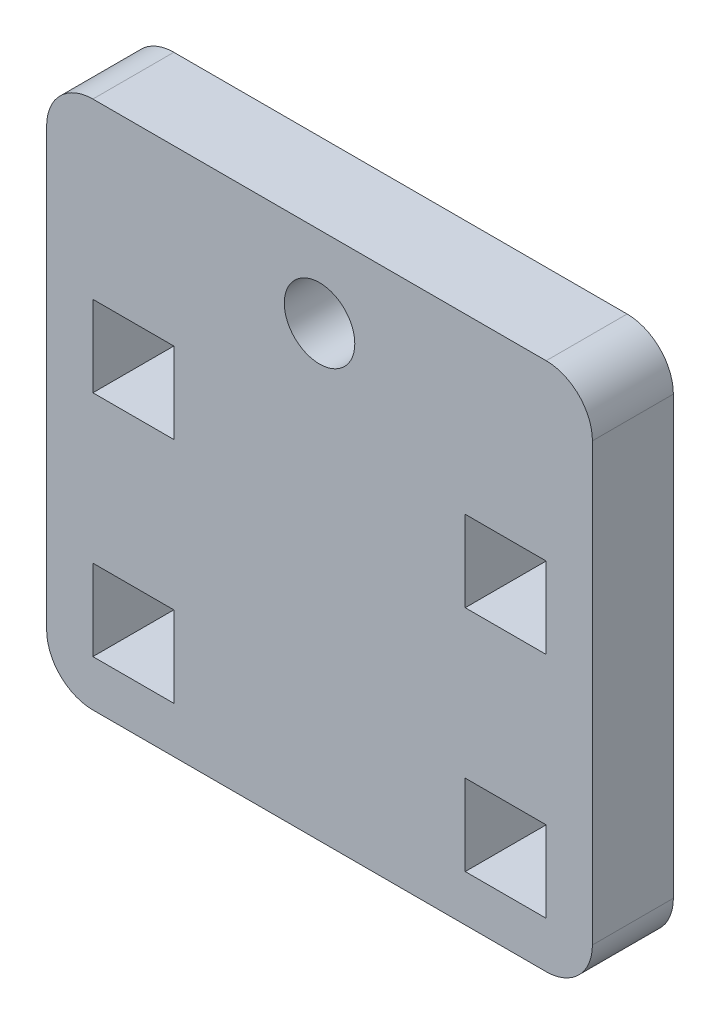
ISO-10303-21;
HEADER;
FILE_DESCRIPTION(('STEP AP214'),'2;1');
FILE_NAME('part.step','',(''),(''),'','','');
FILE_SCHEMA(('AUTOMOTIVE_DESIGN { 1 0 10303 214 1 1 1 1 }'));
ENDSEC;
DATA;
#1=APPLICATION_CONTEXT('core data for automotive mechanical design processes');
#2=APPLICATION_PROTOCOL_DEFINITION('international standard','automotive_design',2000,#1);
#3=PRODUCT_CONTEXT('',#1,'mechanical');
#4=PRODUCT('Part','Part','',(#3));
#5=PRODUCT_RELATED_PRODUCT_CATEGORY('part','',(#4));
#6=PRODUCT_DEFINITION_FORMATION('','',#4);
#7=PRODUCT_DEFINITION_CONTEXT('part definition',#1,'design');
#8=PRODUCT_DEFINITION('design','',#6,#7);
#9=PRODUCT_DEFINITION_SHAPE('','',#8);
#10=(LENGTH_UNIT() NAMED_UNIT(*) SI_UNIT(.MILLI.,.METRE.));
#11=(NAMED_UNIT(*) PLANE_ANGLE_UNIT() SI_UNIT($,.RADIAN.));
#12=(NAMED_UNIT(*) SI_UNIT($,.STERADIAN.) SOLID_ANGLE_UNIT());
#13=UNCERTAINTY_MEASURE_WITH_UNIT(LENGTH_MEASURE(1.E-05),#10,'distance_accuracy_value','');
#14=(GEOMETRIC_REPRESENTATION_CONTEXT(3) GLOBAL_UNCERTAINTY_ASSIGNED_CONTEXT((#13)) GLOBAL_UNIT_ASSIGNED_CONTEXT((#10,
#11,#12)) REPRESENTATION_CONTEXT('',''));
#15=CARTESIAN_POINT('',(0.,0.,0.));
#16=DIRECTION('',(0.,0.,1.));
#17=DIRECTION('',(1.,0.,0.));
#18=AXIS2_PLACEMENT_3D('',#15,#16,#17);
#19=CARTESIAN_POINT('',(0.,0.,3.5));
#20=DIRECTION('',(0.,0.,-1.));
#21=DIRECTION('',(-1.,0.,0.));
#22=AXIS2_PLACEMENT_3D('',#19,#20,#21);
#23=PLANE('',#22);
#24=DIRECTION('',(-1.,0.,0.));
#25=VECTOR('',#24,1.);
#26=CARTESIAN_POINT('',(6.3,15.38,3.5));
#27=LINE('',#26,#25);
#28=CARTESIAN_POINT('',(9.8,15.38,3.5));
#29=VERTEX_POINT('',#28);
#30=CARTESIAN_POINT('',(6.3,15.38,3.5));
#31=VERTEX_POINT('',#30);
#32=EDGE_CURVE('E239',#29,#31,#27,.T.);
#33=ORIENTED_EDGE('',*,*,#32,.F.);
#34=DIRECTION('',(0.,1.,0.));
#35=VECTOR('',#34,1.);
#36=CARTESIAN_POINT('',(9.8,15.38,3.5));
#37=LINE('',#36,#35);
#38=CARTESIAN_POINT('',(9.8,11.88,3.5));
#39=VERTEX_POINT('',#38);
#40=EDGE_CURVE('E247',#39,#29,#37,.T.);
#41=ORIENTED_EDGE('',*,*,#40,.F.);
#42=DIRECTION('',(1.,0.,0.));
#43=VECTOR('',#42,1.);
#44=CARTESIAN_POINT('',(6.3,11.88,3.5));
#45=LINE('',#44,#43);
#46=CARTESIAN_POINT('',(6.3,11.88,3.5));
#47=VERTEX_POINT('',#46);
#48=EDGE_CURVE('E244',#47,#39,#45,.T.);
#49=ORIENTED_EDGE('',*,*,#48,.F.);
#50=DIRECTION('',(0.,-1.,0.));
#51=VECTOR('',#50,1.);
#52=CARTESIAN_POINT('',(6.3,15.38,3.5));
#53=LINE('',#52,#51);
#54=EDGE_CURVE('E241',#31,#47,#53,.T.);
#55=ORIENTED_EDGE('',*,*,#54,.F.);
#56=EDGE_LOOP('',(#33,#41,#49,#55));
#57=FACE_BOUND('',#56,.T.);
#58=DIRECTION('',(0.,-1.,0.));
#59=VECTOR('',#58,1.);
#60=CARTESIAN_POINT('',(-9.8,2.,3.5));
#61=LINE('',#60,#59);
#62=CARTESIAN_POINT('',(-9.8,5.5,3.5));
#63=VERTEX_POINT('',#62);
#64=CARTESIAN_POINT('',(-9.8,2.,3.5));
#65=VERTEX_POINT('',#64);
#66=EDGE_CURVE('E301',#63,#65,#61,.T.);
#67=ORIENTED_EDGE('',*,*,#66,.F.);
#68=DIRECTION('',(-1.,0.,0.));
#69=VECTOR('',#68,1.);
#70=CARTESIAN_POINT('',(-9.8,5.5,3.5));
#71=LINE('',#70,#69);
#72=CARTESIAN_POINT('',(-6.3,5.5,3.5));
#73=VERTEX_POINT('',#72);
#74=EDGE_CURVE('E309',#73,#63,#71,.T.);
#75=ORIENTED_EDGE('',*,*,#74,.F.);
#76=DIRECTION('',(0.,1.,0.));
#77=VECTOR('',#76,1.);
#78=CARTESIAN_POINT('',(-6.3,2.,3.5));
#79=LINE('',#78,#77);
#80=CARTESIAN_POINT('',(-6.3,2.,3.5));
#81=VERTEX_POINT('',#80);
#82=EDGE_CURVE('E306',#81,#73,#79,.T.);
#83=ORIENTED_EDGE('',*,*,#82,.F.);
#84=DIRECTION('',(1.,0.,0.));
#85=VECTOR('',#84,1.);
#86=CARTESIAN_POINT('',(-9.8,2.,3.5));
#87=LINE('',#86,#85);
#88=EDGE_CURVE('E303',#65,#81,#87,.T.);
#89=ORIENTED_EDGE('',*,*,#88,.F.);
#90=EDGE_LOOP('',(#67,#75,#83,#89));
#91=FACE_BOUND('',#90,.T.);
#92=DIRECTION('',(-1.,0.,0.));
#93=VECTOR('',#92,1.);
#94=CARTESIAN_POINT('',(-11.8,22.88,3.5));
#95=LINE('',#94,#93);
#96=CARTESIAN_POINT('',(9.8,22.88,3.5));
#97=VERTEX_POINT('',#96);
#98=CARTESIAN_POINT('',(-9.8,22.88,3.5));
#99=VERTEX_POINT('',#98);
#100=EDGE_CURVE('E340',#97,#99,#95,.T.);
#101=ORIENTED_EDGE('',*,*,#100,.T.);
#102=CARTESIAN_POINT('',(-9.8,20.88,3.5));
#103=DIRECTION('',(0.,0.,-1.));
#104=DIRECTION('',(-1.,0.,0.));
#105=AXIS2_PLACEMENT_3D('',#102,#103,#104);
#106=CIRCLE('',#105,2.);
#107=CARTESIAN_POINT('',(-11.8,20.88,3.5));
#108=VERTEX_POINT('',#107);
#109=EDGE_CURVE('E375',#99,#108,#106,.F.);
#110=ORIENTED_EDGE('',*,*,#109,.T.);
#111=DIRECTION('',(0.,-1.,0.));
#112=VECTOR('',#111,1.);
#113=CARTESIAN_POINT('',(-11.8,0.,3.5));
#114=LINE('',#113,#112);
#115=CARTESIAN_POINT('',(-11.8,2.,3.5));
#116=VERTEX_POINT('',#115);
#117=EDGE_CURVE('E332',#108,#116,#114,.T.);
#118=ORIENTED_EDGE('',*,*,#117,.T.);
#119=CARTESIAN_POINT('',(-9.8,2.,3.5));
#120=DIRECTION('',(0.,0.,-1.));
#121=DIRECTION('',(-1.,0.,0.));
#122=AXIS2_PLACEMENT_3D('',#119,#120,#121);
#123=CIRCLE('',#122,2.);
#124=CARTESIAN_POINT('',(-9.8,0.,3.5));
#125=VERTEX_POINT('',#124);
#126=EDGE_CURVE('E373',#116,#125,#123,.F.);
#127=ORIENTED_EDGE('',*,*,#126,.T.);
#128=DIRECTION('',(1.,0.,0.));
#129=VECTOR('',#128,1.);
#130=CARTESIAN_POINT('',(-11.8,0.,3.5));
#131=LINE('',#130,#129);
#132=CARTESIAN_POINT('',(9.8,0.,3.5));
#133=VERTEX_POINT('',#132);
#134=EDGE_CURVE('E335',#125,#133,#131,.T.);
#135=ORIENTED_EDGE('',*,*,#134,.T.);
#136=CARTESIAN_POINT('',(9.8,2.,3.5));
#137=DIRECTION('',(0.,0.,-1.));
#138=DIRECTION('',(-1.,0.,0.));
#139=AXIS2_PLACEMENT_3D('',#136,#137,#138);
#140=CIRCLE('',#139,2.);
#141=CARTESIAN_POINT('',(11.8,2.,3.5));
#142=VERTEX_POINT('',#141);
#143=EDGE_CURVE('E53',#133,#142,#140,.F.);
#144=ORIENTED_EDGE('',*,*,#143,.T.);
#145=DIRECTION('',(0.,1.,0.));
#146=VECTOR('',#145,1.);
#147=CARTESIAN_POINT('',(11.8,0.,3.5));
#148=LINE('',#147,#146);
#149=CARTESIAN_POINT('',(11.8,20.88,3.5));
#150=VERTEX_POINT('',#149);
#151=EDGE_CURVE('E338',#142,#150,#148,.T.);
#152=ORIENTED_EDGE('',*,*,#151,.T.);
#153=CARTESIAN_POINT('',(9.8,20.88,3.5));
#154=DIRECTION('',(0.,0.,-1.));
#155=DIRECTION('',(-1.,0.,0.));
#156=AXIS2_PLACEMENT_3D('',#153,#154,#155);
#157=CIRCLE('',#156,2.);
#158=EDGE_CURVE('E370',#150,#97,#157,.F.);
#159=ORIENTED_EDGE('',*,*,#158,.T.);
#160=EDGE_LOOP('',(#101,#110,#118,#127,#135,#144,#152,#159));
#161=FACE_BOUND('',#160,.T.);
#162=DIRECTION('',(0.,-1.,0.));
#163=VECTOR('',#162,1.);
#164=CARTESIAN_POINT('',(6.3,2.,3.5));
#165=LINE('',#164,#163);
#166=CARTESIAN_POINT('',(6.3,5.5,3.5));
#167=VERTEX_POINT('',#166);
#168=CARTESIAN_POINT('',(6.3,2.,3.5));
#169=VERTEX_POINT('',#168);
#170=EDGE_CURVE('E270',#167,#169,#165,.T.);
#171=ORIENTED_EDGE('',*,*,#170,.F.);
#172=DIRECTION('',(-1.,0.,0.));
#173=VECTOR('',#172,1.);
#174=CARTESIAN_POINT('',(6.3,5.5,3.5));
#175=LINE('',#174,#173);
#176=CARTESIAN_POINT('',(9.8,5.5,3.5));
#177=VERTEX_POINT('',#176);
#178=EDGE_CURVE('E278',#177,#167,#175,.T.);
#179=ORIENTED_EDGE('',*,*,#178,.F.);
#180=DIRECTION('',(0.,1.,0.));
#181=VECTOR('',#180,1.);
#182=CARTESIAN_POINT('',(9.8,2.,3.5));
#183=LINE('',#182,#181);
#184=CARTESIAN_POINT('',(9.8,2.,3.5));
#185=VERTEX_POINT('',#184);
#186=EDGE_CURVE('E275',#185,#177,#183,.T.);
#187=ORIENTED_EDGE('',*,*,#186,.F.);
#188=DIRECTION('',(1.,0.,0.));
#189=VECTOR('',#188,1.);
#190=CARTESIAN_POINT('',(6.3,2.,3.5));
#191=LINE('',#190,#189);
#192=EDGE_CURVE('E272',#169,#185,#191,.T.);
#193=ORIENTED_EDGE('',*,*,#192,.F.);
#194=EDGE_LOOP('',(#171,#179,#187,#193));
#195=FACE_BOUND('',#194,.T.);
#196=DIRECTION('',(0.,-1.,0.));
#197=VECTOR('',#196,1.);
#198=CARTESIAN_POINT('',(-9.8,15.38,3.5));
#199=LINE('',#198,#197);
#200=CARTESIAN_POINT('',(-9.8,15.38,3.5));
#201=VERTEX_POINT('',#200);
#202=CARTESIAN_POINT('',(-9.8,11.88,3.5));
#203=VERTEX_POINT('',#202);
#204=EDGE_CURVE('E195',#201,#203,#199,.T.);
#205=ORIENTED_EDGE('',*,*,#204,.F.);
#206=DIRECTION('',(-1.,0.,0.));
#207=VECTOR('',#206,1.);
#208=CARTESIAN_POINT('',(-9.8,15.38,3.5));
#209=LINE('',#208,#207);
#210=CARTESIAN_POINT('',(-6.3,15.38,3.5));
#211=VERTEX_POINT('',#210);
#212=EDGE_CURVE('E221',#211,#201,#209,.T.);
#213=ORIENTED_EDGE('',*,*,#212,.F.);
#214=DIRECTION('',(0.,1.,0.));
#215=VECTOR('',#214,1.);
#216=CARTESIAN_POINT('',(-6.3,15.38,3.5));
#217=LINE('',#216,#215);
#218=CARTESIAN_POINT('',(-6.3,11.88,3.5));
#219=VERTEX_POINT('',#218);
#220=EDGE_CURVE('E219',#219,#211,#217,.T.);
#221=ORIENTED_EDGE('',*,*,#220,.F.);
#222=DIRECTION('',(1.,0.,0.));
#223=VECTOR('',#222,1.);
#224=CARTESIAN_POINT('',(-9.8,11.88,3.5));
#225=LINE('',#224,#223);
#226=EDGE_CURVE('E205',#203,#219,#225,.T.);
#227=ORIENTED_EDGE('',*,*,#226,.F.);
#228=EDGE_LOOP('',(#205,#213,#221,#227));
#229=FACE_BOUND('',#228,.T.);
#230=CARTESIAN_POINT('',(0.,19.38,3.5));
#231=DIRECTION('',(0.,0.,1.));
#232=DIRECTION('',(1.,0.,0.));
#233=AXIS2_PLACEMENT_3D('',#230,#231,#232);
#234=CIRCLE('',#233,1.525);
#235=CARTESIAN_POINT('',(1.525,19.38,3.5));
#236=VERTEX_POINT('',#235);
#237=EDGE_CURVE('E228',#236,#236,#234,.T.);
#238=ORIENTED_EDGE('',*,*,#237,.F.);
#239=EDGE_LOOP('',(#238));
#240=FACE_BOUND('',#239,.T.);
#241=ADVANCED_FACE('F32',(#57,#91,#161,#195,#229,#240),#23,.F.);
#242=CARTESIAN_POINT('',(0.,0.,0.));
#243=DIRECTION('',(0.,0.,-1.));
#244=DIRECTION('',(-1.,0.,0.));
#245=AXIS2_PLACEMENT_3D('',#242,#243,#244);
#246=PLANE('',#245);
#247=DIRECTION('',(-1.,0.,0.));
#248=VECTOR('',#247,1.);
#249=CARTESIAN_POINT('',(-9.8,15.38,0.));
#250=LINE('',#249,#248);
#251=CARTESIAN_POINT('',(-6.3,15.38,0.));
#252=VERTEX_POINT('',#251);
#253=CARTESIAN_POINT('',(-9.8,15.38,0.));
#254=VERTEX_POINT('',#253);
#255=EDGE_CURVE('E206',#252,#254,#250,.T.);
#256=ORIENTED_EDGE('',*,*,#255,.T.);
#257=DIRECTION('',(0.,-1.,0.));
#258=VECTOR('',#257,1.);
#259=CARTESIAN_POINT('',(-9.8,15.38,0.));
#260=LINE('',#259,#258);
#261=CARTESIAN_POINT('',(-9.8,11.88,0.));
#262=VERTEX_POINT('',#261);
#263=EDGE_CURVE('E226',#254,#262,#260,.T.);
#264=ORIENTED_EDGE('',*,*,#263,.T.);
#265=DIRECTION('',(1.,0.,0.));
#266=VECTOR('',#265,1.);
#267=CARTESIAN_POINT('',(-9.8,11.88,0.));
#268=LINE('',#267,#266);
#269=CARTESIAN_POINT('',(-6.3,11.88,0.));
#270=VERTEX_POINT('',#269);
#271=EDGE_CURVE('E212',#262,#270,#268,.T.);
#272=ORIENTED_EDGE('',*,*,#271,.T.);
#273=DIRECTION('',(0.,1.,0.));
#274=VECTOR('',#273,1.);
#275=CARTESIAN_POINT('',(-6.3,15.38,0.));
#276=LINE('',#275,#274);
#277=EDGE_CURVE('E230',#270,#252,#276,.T.);
#278=ORIENTED_EDGE('',*,*,#277,.T.);
#279=EDGE_LOOP('',(#256,#264,#272,#278));
#280=FACE_BOUND('',#279,.T.);
#281=DIRECTION('',(0.,1.,0.));
#282=VECTOR('',#281,1.);
#283=CARTESIAN_POINT('',(9.8,15.38,0.));
#284=LINE('',#283,#282);
#285=CARTESIAN_POINT('',(9.8,11.88,0.));
#286=VERTEX_POINT('',#285);
#287=CARTESIAN_POINT('',(9.8,15.38,0.));
#288=VERTEX_POINT('',#287);
#289=EDGE_CURVE('E242',#286,#288,#284,.T.);
#290=ORIENTED_EDGE('',*,*,#289,.T.);
#291=DIRECTION('',(-1.,0.,0.));
#292=VECTOR('',#291,1.);
#293=CARTESIAN_POINT('',(6.3,15.38,0.));
#294=LINE('',#293,#292);
#295=CARTESIAN_POINT('',(6.3,15.38,0.));
#296=VERTEX_POINT('',#295);
#297=EDGE_CURVE('E213',#288,#296,#294,.T.);
#298=ORIENTED_EDGE('',*,*,#297,.T.);
#299=DIRECTION('',(0.,-1.,0.));
#300=VECTOR('',#299,1.);
#301=CARTESIAN_POINT('',(6.3,15.38,0.));
#302=LINE('',#301,#300);
#303=CARTESIAN_POINT('',(6.3,11.88,0.));
#304=VERTEX_POINT('',#303);
#305=EDGE_CURVE('E252',#296,#304,#302,.T.);
#306=ORIENTED_EDGE('',*,*,#305,.T.);
#307=DIRECTION('',(1.,0.,0.));
#308=VECTOR('',#307,1.);
#309=CARTESIAN_POINT('',(6.3,11.88,0.));
#310=LINE('',#309,#308);
#311=EDGE_CURVE('E255',#304,#286,#310,.T.);
#312=ORIENTED_EDGE('',*,*,#311,.T.);
#313=EDGE_LOOP('',(#290,#298,#306,#312));
#314=FACE_BOUND('',#313,.T.);
#315=DIRECTION('',(-1.,0.,0.));
#316=VECTOR('',#315,1.);
#317=CARTESIAN_POINT('',(6.3,5.5,0.));
#318=LINE('',#317,#316);
#319=CARTESIAN_POINT('',(9.8,5.5,0.));
#320=VERTEX_POINT('',#319);
#321=CARTESIAN_POINT('',(6.3,5.5,0.));
#322=VERTEX_POINT('',#321);
#323=EDGE_CURVE('E273',#320,#322,#318,.T.);
#324=ORIENTED_EDGE('',*,*,#323,.T.);
#325=DIRECTION('',(0.,-1.,0.));
#326=VECTOR('',#325,1.);
#327=CARTESIAN_POINT('',(6.3,2.,0.));
#328=LINE('',#327,#326);
#329=CARTESIAN_POINT('',(6.3,2.,0.));
#330=VERTEX_POINT('',#329);
#331=EDGE_CURVE('E269',#322,#330,#328,.T.);
#332=ORIENTED_EDGE('',*,*,#331,.T.);
#333=DIRECTION('',(1.,0.,0.));
#334=VECTOR('',#333,1.);
#335=CARTESIAN_POINT('',(6.3,2.,0.));
#336=LINE('',#335,#334);
#337=CARTESIAN_POINT('',(9.8,2.,0.));
#338=VERTEX_POINT('',#337);
#339=EDGE_CURVE('E283',#330,#338,#336,.T.);
#340=ORIENTED_EDGE('',*,*,#339,.T.);
#341=DIRECTION('',(0.,1.,0.));
#342=VECTOR('',#341,1.);
#343=CARTESIAN_POINT('',(9.8,2.,0.));
#344=LINE('',#343,#342);
#345=EDGE_CURVE('E286',#338,#320,#344,.T.);
#346=ORIENTED_EDGE('',*,*,#345,.T.);
#347=EDGE_LOOP('',(#324,#332,#340,#346));
#348=FACE_BOUND('',#347,.T.);
#349=DIRECTION('',(-1.,0.,0.));
#350=VECTOR('',#349,1.);
#351=CARTESIAN_POINT('',(-9.8,5.5,0.));
#352=LINE('',#351,#350);
#353=CARTESIAN_POINT('',(-6.3,5.5,0.));
#354=VERTEX_POINT('',#353);
#355=CARTESIAN_POINT('',(-9.8,5.5,0.));
#356=VERTEX_POINT('',#355);
#357=EDGE_CURVE('E304',#354,#356,#352,.T.);
#358=ORIENTED_EDGE('',*,*,#357,.T.);
#359=DIRECTION('',(0.,-1.,0.));
#360=VECTOR('',#359,1.);
#361=CARTESIAN_POINT('',(-9.8,2.,0.));
#362=LINE('',#361,#360);
#363=CARTESIAN_POINT('',(-9.8,2.,0.));
#364=VERTEX_POINT('',#363);
#365=EDGE_CURVE('E300',#356,#364,#362,.T.);
#366=ORIENTED_EDGE('',*,*,#365,.T.);
#367=DIRECTION('',(1.,0.,0.));
#368=VECTOR('',#367,1.);
#369=CARTESIAN_POINT('',(-9.8,2.,0.));
#370=LINE('',#369,#368);
#371=CARTESIAN_POINT('',(-6.3,2.,0.));
#372=VERTEX_POINT('',#371);
#373=EDGE_CURVE('E314',#364,#372,#370,.T.);
#374=ORIENTED_EDGE('',*,*,#373,.T.);
#375=DIRECTION('',(0.,1.,0.));
#376=VECTOR('',#375,1.);
#377=CARTESIAN_POINT('',(-6.3,2.,0.));
#378=LINE('',#377,#376);
#379=EDGE_CURVE('E317',#372,#354,#378,.T.);
#380=ORIENTED_EDGE('',*,*,#379,.T.);
#381=EDGE_LOOP('',(#358,#366,#374,#380));
#382=FACE_BOUND('',#381,.T.);
#383=DIRECTION('',(0.,-1.,0.));
#384=VECTOR('',#383,1.);
#385=CARTESIAN_POINT('',(-11.8,0.,0.));
#386=LINE('',#385,#384);
#387=CARTESIAN_POINT('',(-11.8,20.88,0.));
#388=VERTEX_POINT('',#387);
#389=CARTESIAN_POINT('',(-11.8,2.,0.));
#390=VERTEX_POINT('',#389);
#391=EDGE_CURVE('E331',#388,#390,#386,.T.);
#392=ORIENTED_EDGE('',*,*,#391,.F.);
#393=CARTESIAN_POINT('',(-9.8,20.88,0.));
#394=DIRECTION('',(0.,0.,-1.));
#395=DIRECTION('',(-1.,0.,0.));
#396=AXIS2_PLACEMENT_3D('',#393,#394,#395);
#397=CIRCLE('',#396,2.);
#398=CARTESIAN_POINT('',(-9.8,22.88,0.));
#399=VERTEX_POINT('',#398);
#400=EDGE_CURVE('E363',#388,#399,#397,.T.);
#401=ORIENTED_EDGE('',*,*,#400,.T.);
#402=DIRECTION('',(-1.,0.,0.));
#403=VECTOR('',#402,1.);
#404=CARTESIAN_POINT('',(-11.8,22.88,0.));
#405=LINE('',#404,#403);
#406=CARTESIAN_POINT('',(9.8,22.88,0.));
#407=VERTEX_POINT('',#406);
#408=EDGE_CURVE('E336',#407,#399,#405,.T.);
#409=ORIENTED_EDGE('',*,*,#408,.F.);
#410=CARTESIAN_POINT('',(9.8,20.88,0.));
#411=DIRECTION('',(0.,0.,-1.));
#412=DIRECTION('',(-1.,0.,0.));
#413=AXIS2_PLACEMENT_3D('',#410,#411,#412);
#414=CIRCLE('',#413,2.);
#415=CARTESIAN_POINT('',(11.8,20.88,0.));
#416=VERTEX_POINT('',#415);
#417=EDGE_CURVE('E357',#407,#416,#414,.T.);
#418=ORIENTED_EDGE('',*,*,#417,.T.);
#419=DIRECTION('',(0.,1.,0.));
#420=VECTOR('',#419,1.);
#421=CARTESIAN_POINT('',(11.8,0.,0.));
#422=LINE('',#421,#420);
#423=CARTESIAN_POINT('',(11.8,2.,0.));
#424=VERTEX_POINT('',#423);
#425=EDGE_CURVE('E349',#424,#416,#422,.T.);
#426=ORIENTED_EDGE('',*,*,#425,.F.);
#427=CARTESIAN_POINT('',(9.8,2.,0.));
#428=DIRECTION('',(0.,0.,-1.));
#429=DIRECTION('',(-1.,0.,0.));
#430=AXIS2_PLACEMENT_3D('',#427,#428,#429);
#431=CIRCLE('',#430,2.);
#432=CARTESIAN_POINT('',(9.8,0.,0.));
#433=VERTEX_POINT('',#432);
#434=EDGE_CURVE('E359',#424,#433,#431,.T.);
#435=ORIENTED_EDGE('',*,*,#434,.T.);
#436=DIRECTION('',(1.,0.,0.));
#437=VECTOR('',#436,1.);
#438=CARTESIAN_POINT('',(-11.8,0.,0.));
#439=LINE('',#438,#437);
#440=CARTESIAN_POINT('',(-9.8,0.,0.));
#441=VERTEX_POINT('',#440);
#442=EDGE_CURVE('E346',#441,#433,#439,.T.);
#443=ORIENTED_EDGE('',*,*,#442,.F.);
#444=CARTESIAN_POINT('',(-9.8,2.,0.));
#445=DIRECTION('',(0.,0.,-1.));
#446=DIRECTION('',(-1.,0.,0.));
#447=AXIS2_PLACEMENT_3D('',#444,#445,#446);
#448=CIRCLE('',#447,2.);
#449=EDGE_CURVE('E361',#441,#390,#448,.T.);
#450=ORIENTED_EDGE('',*,*,#449,.T.);
#451=EDGE_LOOP('',(#392,#401,#409,#418,#426,#435,#443,#450));
#452=FACE_BOUND('',#451,.T.);
#453=CARTESIAN_POINT('',(0.,19.38,0.));
#454=DIRECTION('',(0.,0.,1.));
#455=DIRECTION('',(1.,0.,0.));
#456=AXIS2_PLACEMENT_3D('',#453,#454,#455);
#457=CIRCLE('',#456,1.525);
#458=CARTESIAN_POINT('',(1.525,19.38,0.));
#459=VERTEX_POINT('',#458);
#460=EDGE_CURVE('E669',#459,#459,#457,.T.);
#461=ORIENTED_EDGE('',*,*,#460,.T.);
#462=EDGE_LOOP('',(#461));
#463=FACE_BOUND('',#462,.T.);
#464=ADVANCED_FACE('F391',(#280,#314,#348,#382,#452,#463),#246,.T.);
#465=CARTESIAN_POINT('',(-11.8,0.,3.5));
#466=DIRECTION('',(1.,0.,0.));
#467=DIRECTION('',(0.,0.,-1.));
#468=AXIS2_PLACEMENT_3D('',#465,#466,#467);
#469=PLANE('',#468);
#470=ORIENTED_EDGE('',*,*,#117,.F.);
#471=DIRECTION('',(0.,0.,-1.));
#472=VECTOR('',#471,1.);
#473=CARTESIAN_POINT('',(-11.8,20.88,3.5));
#474=LINE('',#473,#472);
#475=EDGE_CURVE('E354',#108,#388,#474,.T.);
#476=ORIENTED_EDGE('',*,*,#475,.T.);
#477=ORIENTED_EDGE('',*,*,#391,.T.);
#478=DIRECTION('',(0.,0.,-1.));
#479=VECTOR('',#478,1.);
#480=CARTESIAN_POINT('',(-11.8,2.,3.5));
#481=LINE('',#480,#479);
#482=EDGE_CURVE('E343',#390,#116,#481,.F.);
#483=ORIENTED_EDGE('',*,*,#482,.T.);
#484=EDGE_LOOP('',(#470,#476,#477,#483));
#485=FACE_BOUND('',#484,.T.);
#486=ADVANCED_FACE('F413',(#485),#469,.F.);
#487=CARTESIAN_POINT('',(-11.8,0.,3.5));
#488=DIRECTION('',(0.,1.,0.));
#489=DIRECTION('',(0.,0.,1.));
#490=AXIS2_PLACEMENT_3D('',#487,#488,#489);
#491=PLANE('',#490);
#492=ORIENTED_EDGE('',*,*,#134,.F.);
#493=DIRECTION('',(0.,0.,-1.));
#494=VECTOR('',#493,1.);
#495=CARTESIAN_POINT('',(-9.8,0.,3.5));
#496=LINE('',#495,#494);
#497=EDGE_CURVE('E379',#125,#441,#496,.T.);
#498=ORIENTED_EDGE('',*,*,#497,.T.);
#499=ORIENTED_EDGE('',*,*,#442,.T.);
#500=DIRECTION('',(0.,0.,-1.));
#501=VECTOR('',#500,1.);
#502=CARTESIAN_POINT('',(9.8,0.,3.5));
#503=LINE('',#502,#501);
#504=EDGE_CURVE('E377',#433,#133,#503,.F.);
#505=ORIENTED_EDGE('',*,*,#504,.T.);
#506=EDGE_LOOP('',(#492,#498,#499,#505));
#507=FACE_BOUND('',#506,.T.);
#508=ADVANCED_FACE('F385',(#507),#491,.F.);
#509=CARTESIAN_POINT('',(11.8,0.,3.5));
#510=DIRECTION('',(-1.,0.,0.));
#511=DIRECTION('',(0.,0.,1.));
#512=AXIS2_PLACEMENT_3D('',#509,#510,#511);
#513=PLANE('',#512);
#514=ORIENTED_EDGE('',*,*,#151,.F.);
#515=DIRECTION('',(0.,0.,-1.));
#516=VECTOR('',#515,1.);
#517=CARTESIAN_POINT('',(11.8,2.,3.5));
#518=LINE('',#517,#516);
#519=EDGE_CURVE('E11',#142,#424,#518,.T.);
#520=ORIENTED_EDGE('',*,*,#519,.T.);
#521=ORIENTED_EDGE('',*,*,#425,.T.);
#522=DIRECTION('',(0.,0.,-1.));
#523=VECTOR('',#522,1.);
#524=CARTESIAN_POINT('',(11.8,20.88,3.5));
#525=LINE('',#524,#523);
#526=EDGE_CURVE('E40',#416,#150,#525,.F.);
#527=ORIENTED_EDGE('',*,*,#526,.T.);
#528=EDGE_LOOP('',(#514,#520,#521,#527));
#529=FACE_BOUND('',#528,.T.);
#530=ADVANCED_FACE('F397',(#529),#513,.F.);
#531=CARTESIAN_POINT('',(-11.8,22.88,3.5));
#532=DIRECTION('',(0.,-1.,0.));
#533=DIRECTION('',(0.,0.,-1.));
#534=AXIS2_PLACEMENT_3D('',#531,#532,#533);
#535=PLANE('',#534);
#536=ORIENTED_EDGE('',*,*,#408,.T.);
#537=DIRECTION('',(0.,0.,-1.));
#538=VECTOR('',#537,1.);
#539=CARTESIAN_POINT('',(-9.8,22.88,3.5));
#540=LINE('',#539,#538);
#541=EDGE_CURVE('E368',#399,#99,#540,.F.);
#542=ORIENTED_EDGE('',*,*,#541,.T.);
#543=ORIENTED_EDGE('',*,*,#100,.F.);
#544=DIRECTION('',(0.,0.,-1.));
#545=VECTOR('',#544,1.);
#546=CARTESIAN_POINT('',(9.8,22.88,3.5));
#547=LINE('',#546,#545);
#548=EDGE_CURVE('E365',#97,#407,#547,.T.);
#549=ORIENTED_EDGE('',*,*,#548,.T.);
#550=EDGE_LOOP('',(#536,#542,#543,#549));
#551=FACE_BOUND('',#550,.T.);
#552=ADVANCED_FACE('F405',(#551),#535,.F.);
#553=CARTESIAN_POINT('',(-9.8,2.,3.5));
#554=DIRECTION('',(1.,0.,0.));
#555=DIRECTION('',(0.,0.,-1.));
#556=AXIS2_PLACEMENT_3D('',#553,#554,#555);
#557=PLANE('',#556);
#558=ORIENTED_EDGE('',*,*,#365,.F.);
#559=DIRECTION('',(0.,0.,-1.));
#560=VECTOR('',#559,1.);
#561=CARTESIAN_POINT('',(-9.8,5.5,3.5));
#562=LINE('',#561,#560);
#563=EDGE_CURVE('E311',#63,#356,#562,.T.);
#564=ORIENTED_EDGE('',*,*,#563,.F.);
#565=ORIENTED_EDGE('',*,*,#66,.T.);
#566=DIRECTION('',(0.,0.,-1.));
#567=VECTOR('',#566,1.);
#568=CARTESIAN_POINT('',(-9.8,2.,3.5));
#569=LINE('',#568,#567);
#570=EDGE_CURVE('E328',#65,#364,#569,.T.);
#571=ORIENTED_EDGE('',*,*,#570,.T.);
#572=EDGE_LOOP('',(#558,#564,#565,#571));
#573=FACE_BOUND('',#572,.T.);
#574=ADVANCED_FACE('F435',(#573),#557,.T.);
#575=CARTESIAN_POINT('',(-9.8,2.,3.5));
#576=DIRECTION('',(0.,1.,0.));
#577=DIRECTION('',(-1.,0.,0.));
#578=AXIS2_PLACEMENT_3D('',#575,#576,#577);
#579=PLANE('',#578);
#580=ORIENTED_EDGE('',*,*,#373,.F.);
#581=ORIENTED_EDGE('',*,*,#570,.F.);
#582=ORIENTED_EDGE('',*,*,#88,.T.);
#583=DIRECTION('',(0.,0.,-1.));
#584=VECTOR('',#583,1.);
#585=CARTESIAN_POINT('',(-6.3,2.,3.5));
#586=LINE('',#585,#584);
#587=EDGE_CURVE('E326',#81,#372,#586,.T.);
#588=ORIENTED_EDGE('',*,*,#587,.T.);
#589=EDGE_LOOP('',(#580,#581,#582,#588));
#590=FACE_BOUND('',#589,.T.);
#591=ADVANCED_FACE('F468',(#590),#579,.T.);
#592=CARTESIAN_POINT('',(-6.3,2.,3.5));
#593=DIRECTION('',(-1.,0.,0.));
#594=DIRECTION('',(0.,0.,1.));
#595=AXIS2_PLACEMENT_3D('',#592,#593,#594);
#596=PLANE('',#595);
#597=ORIENTED_EDGE('',*,*,#379,.F.);
#598=ORIENTED_EDGE('',*,*,#587,.F.);
#599=ORIENTED_EDGE('',*,*,#82,.T.);
#600=DIRECTION('',(0.,0.,-1.));
#601=VECTOR('',#600,1.);
#602=CARTESIAN_POINT('',(-6.3,5.5,3.5));
#603=LINE('',#602,#601);
#604=EDGE_CURVE('E324',#73,#354,#603,.T.);
#605=ORIENTED_EDGE('',*,*,#604,.T.);
#606=EDGE_LOOP('',(#597,#598,#599,#605));
#607=FACE_BOUND('',#606,.T.);
#608=ADVANCED_FACE('F475',(#607),#596,.T.);
#609=CARTESIAN_POINT('',(-9.8,5.5,3.5));
#610=DIRECTION('',(0.,-1.,0.));
#611=DIRECTION('',(0.,0.,-1.));
#612=AXIS2_PLACEMENT_3D('',#609,#610,#611);
#613=PLANE('',#612);
#614=ORIENTED_EDGE('',*,*,#357,.F.);
#615=ORIENTED_EDGE('',*,*,#604,.F.);
#616=ORIENTED_EDGE('',*,*,#74,.T.);
#617=ORIENTED_EDGE('',*,*,#563,.T.);
#618=EDGE_LOOP('',(#614,#615,#616,#617));
#619=FACE_BOUND('',#618,.T.);
#620=ADVANCED_FACE('F482',(#619),#613,.T.);
#621=CARTESIAN_POINT('',(6.3,2.,3.5));
#622=DIRECTION('',(1.,0.,0.));
#623=DIRECTION('',(0.,0.,-1.));
#624=AXIS2_PLACEMENT_3D('',#621,#622,#623);
#625=PLANE('',#624);
#626=ORIENTED_EDGE('',*,*,#331,.F.);
#627=DIRECTION('',(0.,0.,-1.));
#628=VECTOR('',#627,1.);
#629=CARTESIAN_POINT('',(6.3,5.5,3.5));
#630=LINE('',#629,#628);
#631=EDGE_CURVE('E280',#167,#322,#630,.T.);
#632=ORIENTED_EDGE('',*,*,#631,.F.);
#633=ORIENTED_EDGE('',*,*,#170,.T.);
#634=DIRECTION('',(0.,0.,-1.));
#635=VECTOR('',#634,1.);
#636=CARTESIAN_POINT('',(6.3,2.,3.5));
#637=LINE('',#636,#635);
#638=EDGE_CURVE('E297',#169,#330,#637,.T.);
#639=ORIENTED_EDGE('',*,*,#638,.T.);
#640=EDGE_LOOP('',(#626,#632,#633,#639));
#641=FACE_BOUND('',#640,.T.);
#642=ADVANCED_FACE('F490',(#641),#625,.T.);
#643=CARTESIAN_POINT('',(6.3,2.,3.5));
#644=DIRECTION('',(0.,1.,0.));
#645=DIRECTION('',(0.,0.,1.));
#646=AXIS2_PLACEMENT_3D('',#643,#644,#645);
#647=PLANE('',#646);
#648=ORIENTED_EDGE('',*,*,#339,.F.);
#649=ORIENTED_EDGE('',*,*,#638,.F.);
#650=ORIENTED_EDGE('',*,*,#192,.T.);
#651=DIRECTION('',(0.,0.,-1.));
#652=VECTOR('',#651,1.);
#653=CARTESIAN_POINT('',(9.8,2.,3.5));
#654=LINE('',#653,#652);
#655=EDGE_CURVE('E295',#185,#338,#654,.T.);
#656=ORIENTED_EDGE('',*,*,#655,.T.);
#657=EDGE_LOOP('',(#648,#649,#650,#656));
#658=FACE_BOUND('',#657,.T.);
#659=ADVANCED_FACE('F498',(#658),#647,.T.);
#660=CARTESIAN_POINT('',(9.8,2.,3.5));
#661=DIRECTION('',(-1.,0.,0.));
#662=DIRECTION('',(0.,0.,1.));
#663=AXIS2_PLACEMENT_3D('',#660,#661,#662);
#664=PLANE('',#663);
#665=ORIENTED_EDGE('',*,*,#345,.F.);
#666=ORIENTED_EDGE('',*,*,#655,.F.);
#667=ORIENTED_EDGE('',*,*,#186,.T.);
#668=DIRECTION('',(0.,0.,-1.));
#669=VECTOR('',#668,1.);
#670=CARTESIAN_POINT('',(9.8,5.5,3.5));
#671=LINE('',#670,#669);
#672=EDGE_CURVE('E293',#177,#320,#671,.T.);
#673=ORIENTED_EDGE('',*,*,#672,.T.);
#674=EDGE_LOOP('',(#665,#666,#667,#673));
#675=FACE_BOUND('',#674,.T.);
#676=ADVANCED_FACE('F506',(#675),#664,.T.);
#677=CARTESIAN_POINT('',(6.3,5.5,3.5));
#678=DIRECTION('',(0.,-1.,0.));
#679=DIRECTION('',(0.,0.,-1.));
#680=AXIS2_PLACEMENT_3D('',#677,#678,#679);
#681=PLANE('',#680);
#682=ORIENTED_EDGE('',*,*,#323,.F.);
#683=ORIENTED_EDGE('',*,*,#672,.F.);
#684=ORIENTED_EDGE('',*,*,#178,.T.);
#685=ORIENTED_EDGE('',*,*,#631,.T.);
#686=EDGE_LOOP('',(#682,#683,#684,#685));
#687=FACE_BOUND('',#686,.T.);
#688=ADVANCED_FACE('F514',(#687),#681,.T.);
#689=CARTESIAN_POINT('',(6.3,15.38,3.5));
#690=DIRECTION('',(0.,-1.,0.));
#691=DIRECTION('',(0.,0.,-1.));
#692=AXIS2_PLACEMENT_3D('',#689,#690,#691);
#693=PLANE('',#692);
#694=ORIENTED_EDGE('',*,*,#297,.F.);
#695=DIRECTION('',(0.,0.,-1.));
#696=VECTOR('',#695,1.);
#697=CARTESIAN_POINT('',(9.8,15.38,3.5));
#698=LINE('',#697,#696);
#699=EDGE_CURVE('E249',#29,#288,#698,.T.);
#700=ORIENTED_EDGE('',*,*,#699,.F.);
#701=ORIENTED_EDGE('',*,*,#32,.T.);
#702=DIRECTION('',(0.,0.,-1.));
#703=VECTOR('',#702,1.);
#704=CARTESIAN_POINT('',(6.3,15.38,3.5));
#705=LINE('',#704,#703);
#706=EDGE_CURVE('E266',#31,#296,#705,.T.);
#707=ORIENTED_EDGE('',*,*,#706,.T.);
#708=EDGE_LOOP('',(#694,#700,#701,#707));
#709=FACE_BOUND('',#708,.T.);
#710=ADVANCED_FACE('F522',(#709),#693,.T.);
#711=CARTESIAN_POINT('',(6.3,15.38,3.5));
#712=DIRECTION('',(1.,0.,0.));
#713=DIRECTION('',(0.,0.,-1.));
#714=AXIS2_PLACEMENT_3D('',#711,#712,#713);
#715=PLANE('',#714);
#716=ORIENTED_EDGE('',*,*,#305,.F.);
#717=ORIENTED_EDGE('',*,*,#706,.F.);
#718=ORIENTED_EDGE('',*,*,#54,.T.);
#719=DIRECTION('',(0.,0.,-1.));
#720=VECTOR('',#719,1.);
#721=CARTESIAN_POINT('',(6.3,11.88,3.5));
#722=LINE('',#721,#720);
#723=EDGE_CURVE('E264',#47,#304,#722,.T.);
#724=ORIENTED_EDGE('',*,*,#723,.T.);
#725=EDGE_LOOP('',(#716,#717,#718,#724));
#726=FACE_BOUND('',#725,.T.);
#727=ADVANCED_FACE('F530',(#726),#715,.T.);
#728=CARTESIAN_POINT('',(6.3,11.88,3.5));
#729=DIRECTION('',(0.,1.,0.));
#730=DIRECTION('',(0.,0.,1.));
#731=AXIS2_PLACEMENT_3D('',#728,#729,#730);
#732=PLANE('',#731);
#733=ORIENTED_EDGE('',*,*,#311,.F.);
#734=ORIENTED_EDGE('',*,*,#723,.F.);
#735=ORIENTED_EDGE('',*,*,#48,.T.);
#736=DIRECTION('',(0.,0.,-1.));
#737=VECTOR('',#736,1.);
#738=CARTESIAN_POINT('',(9.8,11.88,3.5));
#739=LINE('',#738,#737);
#740=EDGE_CURVE('E262',#39,#286,#739,.T.);
#741=ORIENTED_EDGE('',*,*,#740,.T.);
#742=EDGE_LOOP('',(#733,#734,#735,#741));
#743=FACE_BOUND('',#742,.T.);
#744=ADVANCED_FACE('F538',(#743),#732,.T.);
#745=CARTESIAN_POINT('',(9.8,15.38,3.5));
#746=DIRECTION('',(-1.,0.,0.));
#747=DIRECTION('',(0.,0.,1.));
#748=AXIS2_PLACEMENT_3D('',#745,#746,#747);
#749=PLANE('',#748);
#750=ORIENTED_EDGE('',*,*,#289,.F.);
#751=ORIENTED_EDGE('',*,*,#740,.F.);
#752=ORIENTED_EDGE('',*,*,#40,.T.);
#753=ORIENTED_EDGE('',*,*,#699,.T.);
#754=EDGE_LOOP('',(#750,#751,#752,#753));
#755=FACE_BOUND('',#754,.T.);
#756=ADVANCED_FACE('F546',(#755),#749,.T.);
#757=CARTESIAN_POINT('',(-9.8,15.38,3.5));
#758=DIRECTION('',(1.,0.,0.));
#759=DIRECTION('',(0.,0.,-1.));
#760=AXIS2_PLACEMENT_3D('',#757,#758,#759);
#761=PLANE('',#760);
#762=ORIENTED_EDGE('',*,*,#263,.F.);
#763=DIRECTION('',(0.,0.,-1.));
#764=VECTOR('',#763,1.);
#765=CARTESIAN_POINT('',(-9.8,15.38,3.5));
#766=LINE('',#765,#764);
#767=EDGE_CURVE('E201',#201,#254,#766,.T.);
#768=ORIENTED_EDGE('',*,*,#767,.F.);
#769=ORIENTED_EDGE('',*,*,#204,.T.);
#770=DIRECTION('',(0.,0.,-1.));
#771=VECTOR('',#770,1.);
#772=CARTESIAN_POINT('',(-9.8,11.88,3.5));
#773=LINE('',#772,#771);
#774=EDGE_CURVE('E198',#203,#262,#773,.T.);
#775=ORIENTED_EDGE('',*,*,#774,.T.);
#776=EDGE_LOOP('',(#762,#768,#769,#775));
#777=FACE_BOUND('',#776,.T.);
#778=ADVANCED_FACE('F197',(#777),#761,.T.);
#779=CARTESIAN_POINT('',(-9.8,11.88,3.5));
#780=DIRECTION('',(0.,1.,0.));
#781=DIRECTION('',(0.,0.,1.));
#782=AXIS2_PLACEMENT_3D('',#779,#780,#781);
#783=PLANE('',#782);
#784=ORIENTED_EDGE('',*,*,#271,.F.);
#785=ORIENTED_EDGE('',*,*,#774,.F.);
#786=ORIENTED_EDGE('',*,*,#226,.T.);
#787=DIRECTION('',(0.,0.,-1.));
#788=VECTOR('',#787,1.);
#789=CARTESIAN_POINT('',(-6.3,11.88,3.5));
#790=LINE('',#789,#788);
#791=EDGE_CURVE('E214',#219,#270,#790,.T.);
#792=ORIENTED_EDGE('',*,*,#791,.T.);
#793=EDGE_LOOP('',(#784,#785,#786,#792));
#794=FACE_BOUND('',#793,.T.);
#795=ADVANCED_FACE('F209',(#794),#783,.T.);
#796=CARTESIAN_POINT('',(-6.3,15.38,3.5));
#797=DIRECTION('',(-1.,0.,0.));
#798=DIRECTION('',(0.,0.,1.));
#799=AXIS2_PLACEMENT_3D('',#796,#797,#798);
#800=PLANE('',#799);
#801=ORIENTED_EDGE('',*,*,#277,.F.);
#802=ORIENTED_EDGE('',*,*,#791,.F.);
#803=ORIENTED_EDGE('',*,*,#220,.T.);
#804=DIRECTION('',(0.,0.,-1.));
#805=VECTOR('',#804,1.);
#806=CARTESIAN_POINT('',(-6.3,15.38,3.5));
#807=LINE('',#806,#805);
#808=EDGE_CURVE('E236',#211,#252,#807,.T.);
#809=ORIENTED_EDGE('',*,*,#808,.T.);
#810=EDGE_LOOP('',(#801,#802,#803,#809));
#811=FACE_BOUND('',#810,.T.);
#812=ADVANCED_FACE('F567',(#811),#800,.T.);
#813=CARTESIAN_POINT('',(-9.8,15.38,3.5));
#814=DIRECTION('',(0.,-1.,0.));
#815=DIRECTION('',(0.,0.,-1.));
#816=AXIS2_PLACEMENT_3D('',#813,#814,#815);
#817=PLANE('',#816);
#818=ORIENTED_EDGE('',*,*,#255,.F.);
#819=ORIENTED_EDGE('',*,*,#808,.F.);
#820=ORIENTED_EDGE('',*,*,#212,.T.);
#821=ORIENTED_EDGE('',*,*,#767,.T.);
#822=EDGE_LOOP('',(#818,#819,#820,#821));
#823=FACE_BOUND('',#822,.T.);
#824=ADVANCED_FACE('F574',(#823),#817,.T.);
#825=CARTESIAN_POINT('',(0.,19.38,3.5));
#826=DIRECTION('',(0.,0.,-1.));
#827=DIRECTION('',(-1.,0.,0.));
#828=AXIS2_PLACEMENT_3D('',#825,#826,#827);
#829=CYLINDRICAL_SURFACE('',#828,1.525);
#830=ORIENTED_EDGE('',*,*,#237,.T.);
#831=EDGE_LOOP('',(#830));
#832=FACE_BOUND('',#831,.T.);
#833=ORIENTED_EDGE('',*,*,#460,.F.);
#834=EDGE_LOOP('',(#833));
#835=FACE_BOUND('',#834,.T.);
#836=ADVANCED_FACE('F422',(#832,#835),#829,.F.);
#837=CARTESIAN_POINT('',(-9.8,20.88,3.5));
#838=DIRECTION('',(0.,0.,-1.));
#839=DIRECTION('',(-1.,0.,0.));
#840=AXIS2_PLACEMENT_3D('',#837,#838,#839);
#841=CYLINDRICAL_SURFACE('',#840,2.);
#842=ORIENTED_EDGE('',*,*,#109,.F.);
#843=ORIENTED_EDGE('',*,*,#541,.F.);
#844=ORIENTED_EDGE('',*,*,#400,.F.);
#845=ORIENTED_EDGE('',*,*,#475,.F.);
#846=EDGE_LOOP('',(#842,#843,#844,#845));
#847=FACE_BOUND('',#846,.T.);
#848=ADVANCED_FACE('F410',(#847),#841,.T.);
#849=CARTESIAN_POINT('',(-9.8,2.,3.5));
#850=DIRECTION('',(0.,0.,-1.));
#851=DIRECTION('',(-1.,0.,0.));
#852=AXIS2_PLACEMENT_3D('',#849,#850,#851);
#853=CYLINDRICAL_SURFACE('',#852,2.);
#854=ORIENTED_EDGE('',*,*,#126,.F.);
#855=ORIENTED_EDGE('',*,*,#482,.F.);
#856=ORIENTED_EDGE('',*,*,#449,.F.);
#857=ORIENTED_EDGE('',*,*,#497,.F.);
#858=EDGE_LOOP('',(#854,#855,#856,#857));
#859=FACE_BOUND('',#858,.T.);
#860=ADVANCED_FACE('F415',(#859),#853,.T.);
#861=CARTESIAN_POINT('',(9.8,2.,3.5));
#862=DIRECTION('',(0.,0.,-1.));
#863=DIRECTION('',(-1.,0.,0.));
#864=AXIS2_PLACEMENT_3D('',#861,#862,#863);
#865=CYLINDRICAL_SURFACE('',#864,2.);
#866=ORIENTED_EDGE('',*,*,#143,.F.);
#867=ORIENTED_EDGE('',*,*,#504,.F.);
#868=ORIENTED_EDGE('',*,*,#434,.F.);
#869=ORIENTED_EDGE('',*,*,#519,.F.);
#870=EDGE_LOOP('',(#866,#867,#868,#869));
#871=FACE_BOUND('',#870,.T.);
#872=ADVANCED_FACE('F396',(#871),#865,.T.);
#873=CARTESIAN_POINT('',(9.8,20.88,3.5));
#874=DIRECTION('',(0.,0.,-1.));
#875=DIRECTION('',(-1.,0.,0.));
#876=AXIS2_PLACEMENT_3D('',#873,#874,#875);
#877=CYLINDRICAL_SURFACE('',#876,2.);
#878=ORIENTED_EDGE('',*,*,#158,.F.);
#879=ORIENTED_EDGE('',*,*,#526,.F.);
#880=ORIENTED_EDGE('',*,*,#417,.F.);
#881=ORIENTED_EDGE('',*,*,#548,.F.);
#882=EDGE_LOOP('',(#878,#879,#880,#881));
#883=FACE_BOUND('',#882,.T.);
#884=ADVANCED_FACE('F34',(#883),#877,.T.);
#885=CLOSED_SHELL('',(#241,#464,#486,#508,#530,#552,#574,#591,#608,#620,#642,#659,#676,#688,
#710,#727,#744,#756,#778,#795,#812,#824,#836,#848,#860,#872,#884));
#886=MANIFOLD_SOLID_BREP('B2',#885);
#887=ADVANCED_BREP_SHAPE_REPRESENTATION('',(#18,#886),#14);
#888=SHAPE_DEFINITION_REPRESENTATION(#9,#887);
ENDSEC;
END-ISO-10303-21;
